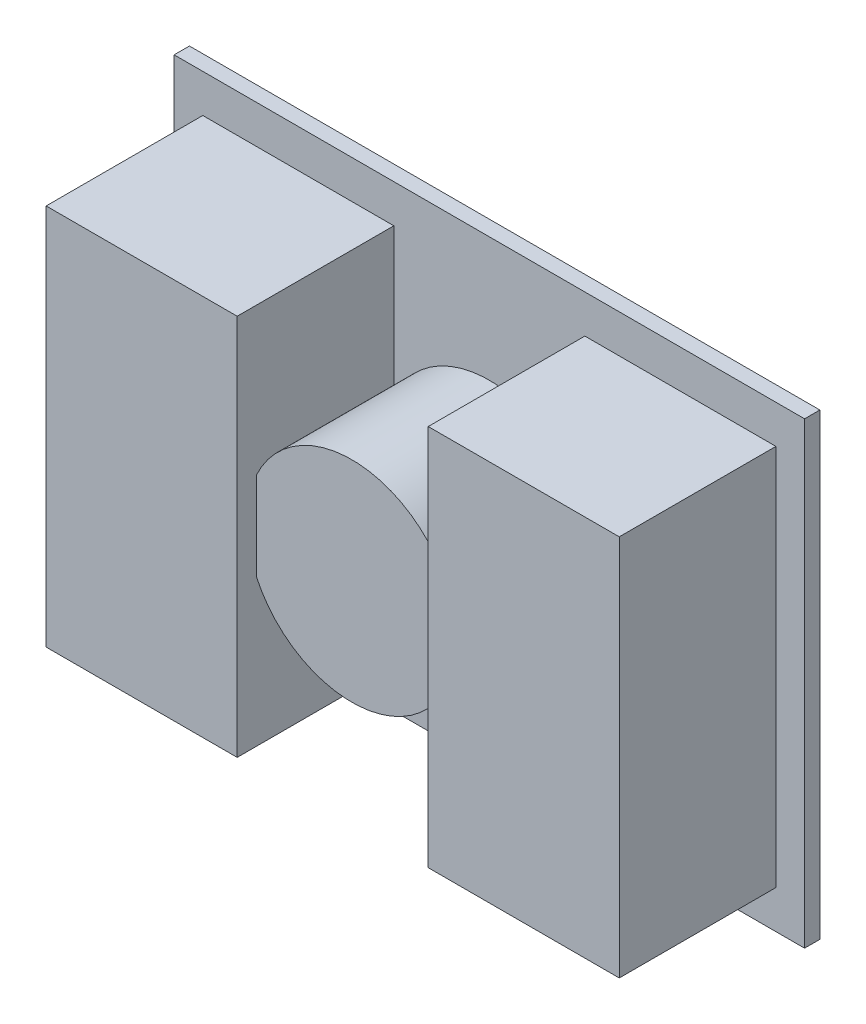
ISO-10303-21;
HEADER;
FILE_DESCRIPTION(('STEP AP214'),'2;1');
FILE_NAME('part.step','',(''),(''),'','','');
FILE_SCHEMA(('AUTOMOTIVE_DESIGN { 1 0 10303 214 1 1 1 1 }'));
ENDSEC;
DATA;
#1=APPLICATION_CONTEXT('core data for automotive mechanical design processes');
#2=APPLICATION_PROTOCOL_DEFINITION('international standard','automotive_design',2000,#1);
#3=PRODUCT_CONTEXT('',#1,'mechanical');
#4=PRODUCT('Part','Part','',(#3));
#5=PRODUCT_RELATED_PRODUCT_CATEGORY('part','',(#4));
#6=PRODUCT_DEFINITION_FORMATION('','',#4);
#7=PRODUCT_DEFINITION_CONTEXT('part definition',#1,'design');
#8=PRODUCT_DEFINITION('design','',#6,#7);
#9=PRODUCT_DEFINITION_SHAPE('','',#8);
#10=(LENGTH_UNIT() NAMED_UNIT(*) SI_UNIT(.MILLI.,.METRE.));
#11=(NAMED_UNIT(*) PLANE_ANGLE_UNIT() SI_UNIT($,.RADIAN.));
#12=(NAMED_UNIT(*) SI_UNIT($,.STERADIAN.) SOLID_ANGLE_UNIT());
#13=UNCERTAINTY_MEASURE_WITH_UNIT(LENGTH_MEASURE(1.E-05),#10,'distance_accuracy_value','');
#14=(GEOMETRIC_REPRESENTATION_CONTEXT(3) GLOBAL_UNCERTAINTY_ASSIGNED_CONTEXT((#13)) GLOBAL_UNIT_ASSIGNED_CONTEXT((#10,
#11,#12)) REPRESENTATION_CONTEXT('',''));
#15=CARTESIAN_POINT('',(0.,0.,0.));
#16=DIRECTION('',(0.,0.,1.));
#17=DIRECTION('',(1.,0.,0.));
#18=AXIS2_PLACEMENT_3D('',#15,#16,#17);
#19=CARTESIAN_POINT('',(0.,0.,1.6));
#20=DIRECTION('',(0.,0.,1.));
#21=DIRECTION('',(1.,0.,0.));
#22=AXIS2_PLACEMENT_3D('',#19,#20,#21);
#23=PLANE('',#22);
#24=DIRECTION('',(0.,-1.,0.));
#25=VECTOR('',#24,1.);
#26=CARTESIAN_POINT('',(-33.,24.,1.6));
#27=LINE('',#26,#25);
#28=CARTESIAN_POINT('',(-33.,24.,1.6));
#29=VERTEX_POINT('',#28);
#30=CARTESIAN_POINT('',(-33.,-24.,1.6));
#31=VERTEX_POINT('',#30);
#32=EDGE_CURVE('E234',#29,#31,#27,.T.);
#33=ORIENTED_EDGE('',*,*,#32,.T.);
#34=DIRECTION('',(1.,0.,0.));
#35=VECTOR('',#34,1.);
#36=CARTESIAN_POINT('',(-33.,-24.,1.6));
#37=LINE('',#36,#35);
#38=CARTESIAN_POINT('',(33.,-24.,1.6));
#39=VERTEX_POINT('',#38);
#40=EDGE_CURVE('E237',#31,#39,#37,.T.);
#41=ORIENTED_EDGE('',*,*,#40,.T.);
#42=DIRECTION('',(0.,1.,0.));
#43=VECTOR('',#42,1.);
#44=CARTESIAN_POINT('',(33.,-24.,1.6));
#45=LINE('',#44,#43);
#46=CARTESIAN_POINT('',(33.,24.,1.6));
#47=VERTEX_POINT('',#46);
#48=EDGE_CURVE('E239',#39,#47,#45,.T.);
#49=ORIENTED_EDGE('',*,*,#48,.T.);
#50=DIRECTION('',(-1.,0.,0.));
#51=VECTOR('',#50,1.);
#52=CARTESIAN_POINT('',(33.,24.,1.6));
#53=LINE('',#52,#51);
#54=EDGE_CURVE('E244',#47,#29,#53,.T.);
#55=ORIENTED_EDGE('',*,*,#54,.T.);
#56=EDGE_LOOP('',(#33,#41,#49,#55));
#57=FACE_BOUND('',#56,.T.);
#58=CARTESIAN_POINT('',(0.,0.,1.6));
#59=DIRECTION('',(0.,0.,1.));
#60=DIRECTION('',(1.,0.,0.));
#61=AXIS2_PLACEMENT_3D('',#58,#59,#60);
#62=CIRCLE('',#61,11.);
#63=CARTESIAN_POINT('',(10.,4.58257569495584,1.6));
#64=VERTEX_POINT('',#63);
#65=CARTESIAN_POINT('',(-10.,4.58257569495584,1.6));
#66=VERTEX_POINT('',#65);
#67=EDGE_CURVE('E152',#64,#66,#62,.T.);
#68=ORIENTED_EDGE('',*,*,#67,.F.);
#69=DIRECTION('',(0.,-1.,0.));
#70=VECTOR('',#69,1.);
#71=CARTESIAN_POINT('',(10.,20.,1.6));
#72=LINE('',#71,#70);
#73=CARTESIAN_POINT('',(10.,20.,1.6));
#74=VERTEX_POINT('',#73);
#75=EDGE_CURVE('E167',#74,#64,#72,.T.);
#76=ORIENTED_EDGE('',*,*,#75,.F.);
#77=DIRECTION('',(-1.,0.,0.));
#78=VECTOR('',#77,1.);
#79=CARTESIAN_POINT('',(30.,20.,1.6));
#80=LINE('',#79,#78);
#81=CARTESIAN_POINT('',(30.,20.,1.6));
#82=VERTEX_POINT('',#81);
#83=EDGE_CURVE('E190',#82,#74,#80,.T.);
#84=ORIENTED_EDGE('',*,*,#83,.F.);
#85=DIRECTION('',(0.,1.,0.));
#86=VECTOR('',#85,1.);
#87=CARTESIAN_POINT('',(30.,-20.,1.6));
#88=LINE('',#87,#86);
#89=CARTESIAN_POINT('',(30.,-20.,1.6));
#90=VERTEX_POINT('',#89);
#91=EDGE_CURVE('E180',#90,#82,#88,.T.);
#92=ORIENTED_EDGE('',*,*,#91,.F.);
#93=DIRECTION('',(1.,0.,0.));
#94=VECTOR('',#93,1.);
#95=CARTESIAN_POINT('',(10.,-20.,1.6));
#96=LINE('',#95,#94);
#97=CARTESIAN_POINT('',(10.,-20.,1.6));
#98=VERTEX_POINT('',#97);
#99=EDGE_CURVE('E177',#98,#90,#96,.T.);
#100=ORIENTED_EDGE('',*,*,#99,.F.);
#101=CARTESIAN_POINT('',(10.,-4.58257569495584,1.6));
#102=VERTEX_POINT('',#101);
#103=EDGE_CURVE('E179',#102,#98,#72,.T.);
#104=ORIENTED_EDGE('',*,*,#103,.F.);
#105=CARTESIAN_POINT('',(-10.,-4.58257569495584,1.6));
#106=VERTEX_POINT('',#105);
#107=EDGE_CURVE('E166',#106,#102,#62,.T.);
#108=ORIENTED_EDGE('',*,*,#107,.F.);
#109=DIRECTION('',(0.,1.,0.));
#110=VECTOR('',#109,1.);
#111=CARTESIAN_POINT('',(-10.,-20.,1.6));
#112=LINE('',#111,#110);
#113=CARTESIAN_POINT('',(-10.,-20.,1.6));
#114=VERTEX_POINT('',#113);
#115=EDGE_CURVE('E216',#114,#106,#112,.T.);
#116=ORIENTED_EDGE('',*,*,#115,.F.);
#117=DIRECTION('',(1.,0.,0.));
#118=VECTOR('',#117,1.);
#119=CARTESIAN_POINT('',(-30.,-20.,1.6));
#120=LINE('',#119,#118);
#121=CARTESIAN_POINT('',(-30.,-20.,1.6));
#122=VERTEX_POINT('',#121);
#123=EDGE_CURVE('E213',#122,#114,#120,.T.);
#124=ORIENTED_EDGE('',*,*,#123,.F.);
#125=DIRECTION('',(0.,-1.,0.));
#126=VECTOR('',#125,1.);
#127=CARTESIAN_POINT('',(-30.,20.,1.6));
#128=LINE('',#127,#126);
#129=CARTESIAN_POINT('',(-30.,20.,1.6));
#130=VERTEX_POINT('',#129);
#131=EDGE_CURVE('E200',#130,#122,#128,.T.);
#132=ORIENTED_EDGE('',*,*,#131,.F.);
#133=DIRECTION('',(-1.,0.,0.));
#134=VECTOR('',#133,1.);
#135=CARTESIAN_POINT('',(-10.,20.,1.6));
#136=LINE('',#135,#134);
#137=CARTESIAN_POINT('',(-10.,20.,1.6));
#138=VERTEX_POINT('',#137);
#139=EDGE_CURVE('E204',#138,#130,#136,.T.);
#140=ORIENTED_EDGE('',*,*,#139,.F.);
#141=EDGE_CURVE('E169',#66,#138,#112,.T.);
#142=ORIENTED_EDGE('',*,*,#141,.F.);
#143=EDGE_LOOP('',(#68,#76,#84,#92,#100,#104,#108,#116,#124,#132,#140,#142));
#144=FACE_BOUND('',#143,.T.);
#145=ADVANCED_FACE('F39',(#57,#144),#23,.T.);
#146=CARTESIAN_POINT('',(-10.,-20.,18.));
#147=DIRECTION('',(-1.,0.,0.));
#148=DIRECTION('',(0.,0.,1.));
#149=AXIS2_PLACEMENT_3D('',#146,#147,#148);
#150=PLANE('',#149);
#151=DIRECTION('',(0.,0.,-1.));
#152=VECTOR('',#151,1.);
#153=CARTESIAN_POINT('',(-10.,4.58257569495584,16.));
#154=LINE('',#153,#152);
#155=CARTESIAN_POINT('',(-10.,4.58257569495584,16.));
#156=VERTEX_POINT('',#155);
#157=EDGE_CURVE('E185',#66,#156,#154,.F.);
#158=ORIENTED_EDGE('',*,*,#157,.F.);
#159=ORIENTED_EDGE('',*,*,#141,.T.);
#160=DIRECTION('',(0.,0.,-1.));
#161=VECTOR('',#160,1.);
#162=CARTESIAN_POINT('',(-10.,20.,18.));
#163=LINE('',#162,#161);
#164=CARTESIAN_POINT('',(-10.,20.,18.));
#165=VERTEX_POINT('',#164);
#166=EDGE_CURVE('E224',#165,#138,#163,.T.);
#167=ORIENTED_EDGE('',*,*,#166,.F.);
#168=DIRECTION('',(0.,1.,0.));
#169=VECTOR('',#168,1.);
#170=CARTESIAN_POINT('',(-10.,-20.,18.));
#171=LINE('',#170,#169);
#172=CARTESIAN_POINT('',(-10.,-20.,18.));
#173=VERTEX_POINT('',#172);
#174=EDGE_CURVE('E206',#173,#165,#171,.T.);
#175=ORIENTED_EDGE('',*,*,#174,.F.);
#176=DIRECTION('',(0.,0.,-1.));
#177=VECTOR('',#176,1.);
#178=CARTESIAN_POINT('',(-10.,-20.,18.));
#179=LINE('',#178,#177);
#180=EDGE_CURVE('E229',#173,#114,#179,.T.);
#181=ORIENTED_EDGE('',*,*,#180,.T.);
#182=ORIENTED_EDGE('',*,*,#115,.T.);
#183=DIRECTION('',(0.,0.,-1.));
#184=VECTOR('',#183,1.);
#185=CARTESIAN_POINT('',(-10.,-4.58257569495584,16.));
#186=LINE('',#185,#184);
#187=CARTESIAN_POINT('',(-10.,-4.58257569495584,16.));
#188=VERTEX_POINT('',#187);
#189=EDGE_CURVE('E269',#188,#106,#186,.T.);
#190=ORIENTED_EDGE('',*,*,#189,.F.);
#191=DIRECTION('',(0.,1.,0.));
#192=VECTOR('',#191,1.);
#193=CARTESIAN_POINT('',(-10.,-20.,16.));
#194=LINE('',#193,#192);
#195=EDGE_CURVE('E264',#188,#156,#194,.T.);
#196=ORIENTED_EDGE('',*,*,#195,.T.);
#197=EDGE_LOOP('',(#158,#159,#167,#175,#181,#182,#190,#196));
#198=FACE_BOUND('',#197,.T.);
#199=ADVANCED_FACE('F267',(#198),#150,.F.);
#200=CARTESIAN_POINT('',(10.,20.,18.));
#201=DIRECTION('',(1.,0.,0.));
#202=DIRECTION('',(0.,0.,-1.));
#203=AXIS2_PLACEMENT_3D('',#200,#201,#202);
#204=PLANE('',#203);
#205=DIRECTION('',(0.,0.,-1.));
#206=VECTOR('',#205,1.);
#207=CARTESIAN_POINT('',(10.,-4.58257569495584,16.));
#208=LINE('',#207,#206);
#209=CARTESIAN_POINT('',(10.,-4.58257569495584,16.));
#210=VERTEX_POINT('',#209);
#211=EDGE_CURVE('E11',#102,#210,#208,.F.);
#212=ORIENTED_EDGE('',*,*,#211,.F.);
#213=ORIENTED_EDGE('',*,*,#103,.T.);
#214=DIRECTION('',(0.,0.,-1.));
#215=VECTOR('',#214,1.);
#216=CARTESIAN_POINT('',(10.,-20.,18.));
#217=LINE('',#216,#215);
#218=CARTESIAN_POINT('',(10.,-20.,18.));
#219=VERTEX_POINT('',#218);
#220=EDGE_CURVE('E198',#219,#98,#217,.T.);
#221=ORIENTED_EDGE('',*,*,#220,.F.);
#222=DIRECTION('',(0.,-1.,0.));
#223=VECTOR('',#222,1.);
#224=CARTESIAN_POINT('',(10.,20.,18.));
#225=LINE('',#224,#223);
#226=CARTESIAN_POINT('',(10.,20.,18.));
#227=VERTEX_POINT('',#226);
#228=EDGE_CURVE('E187',#227,#219,#225,.T.);
#229=ORIENTED_EDGE('',*,*,#228,.F.);
#230=DIRECTION('',(0.,0.,-1.));
#231=VECTOR('',#230,1.);
#232=CARTESIAN_POINT('',(10.,20.,18.));
#233=LINE('',#232,#231);
#234=EDGE_CURVE('E176',#227,#74,#233,.T.);
#235=ORIENTED_EDGE('',*,*,#234,.T.);
#236=ORIENTED_EDGE('',*,*,#75,.T.);
#237=DIRECTION('',(0.,0.,-1.));
#238=VECTOR('',#237,1.);
#239=CARTESIAN_POINT('',(10.,4.58257569495584,16.));
#240=LINE('',#239,#238);
#241=CARTESIAN_POINT('',(10.,4.58257569495584,16.));
#242=VERTEX_POINT('',#241);
#243=EDGE_CURVE('E50',#242,#64,#240,.T.);
#244=ORIENTED_EDGE('',*,*,#243,.F.);
#245=DIRECTION('',(0.,-1.,0.));
#246=VECTOR('',#245,1.);
#247=CARTESIAN_POINT('',(10.,20.,16.));
#248=LINE('',#247,#246);
#249=EDGE_CURVE('E161',#242,#210,#248,.T.);
#250=ORIENTED_EDGE('',*,*,#249,.T.);
#251=EDGE_LOOP('',(#212,#213,#221,#229,#235,#236,#244,#250));
#252=FACE_BOUND('',#251,.T.);
#253=ADVANCED_FACE('F175',(#252),#204,.F.);
#254=CARTESIAN_POINT('',(-33.,24.,1.6));
#255=DIRECTION('',(1.,0.,0.));
#256=DIRECTION('',(0.,0.,-1.));
#257=AXIS2_PLACEMENT_3D('',#254,#255,#256);
#258=PLANE('',#257);
#259=DIRECTION('',(0.,-1.,0.));
#260=VECTOR('',#259,1.);
#261=CARTESIAN_POINT('',(-33.,24.,0.));
#262=LINE('',#261,#260);
#263=CARTESIAN_POINT('',(-33.,24.,0.));
#264=VERTEX_POINT('',#263);
#265=CARTESIAN_POINT('',(-33.,-24.,0.));
#266=VERTEX_POINT('',#265);
#267=EDGE_CURVE('E232',#264,#266,#262,.T.);
#268=ORIENTED_EDGE('',*,*,#267,.T.);
#269=DIRECTION('',(0.,0.,-1.));
#270=VECTOR('',#269,1.);
#271=CARTESIAN_POINT('',(-33.,-24.,1.6));
#272=LINE('',#271,#270);
#273=EDGE_CURVE('E259',#31,#266,#272,.T.);
#274=ORIENTED_EDGE('',*,*,#273,.F.);
#275=ORIENTED_EDGE('',*,*,#32,.F.);
#276=DIRECTION('',(0.,0.,-1.));
#277=VECTOR('',#276,1.);
#278=CARTESIAN_POINT('',(-33.,24.,1.6));
#279=LINE('',#278,#277);
#280=EDGE_CURVE('E245',#29,#264,#279,.T.);
#281=ORIENTED_EDGE('',*,*,#280,.T.);
#282=EDGE_LOOP('',(#268,#274,#275,#281));
#283=FACE_BOUND('',#282,.T.);
#284=ADVANCED_FACE('F41',(#283),#258,.F.);
#285=CARTESIAN_POINT('',(-33.,-24.,1.6));
#286=DIRECTION('',(0.,1.,0.));
#287=DIRECTION('',(0.,0.,1.));
#288=AXIS2_PLACEMENT_3D('',#285,#286,#287);
#289=PLANE('',#288);
#290=DIRECTION('',(1.,0.,0.));
#291=VECTOR('',#290,1.);
#292=CARTESIAN_POINT('',(-33.,-24.,0.));
#293=LINE('',#292,#291);
#294=CARTESIAN_POINT('',(33.,-24.,0.));
#295=VERTEX_POINT('',#294);
#296=EDGE_CURVE('E246',#266,#295,#293,.T.);
#297=ORIENTED_EDGE('',*,*,#296,.T.);
#298=DIRECTION('',(0.,0.,-1.));
#299=VECTOR('',#298,1.);
#300=CARTESIAN_POINT('',(33.,-24.,1.6));
#301=LINE('',#300,#299);
#302=EDGE_CURVE('E258',#39,#295,#301,.T.);
#303=ORIENTED_EDGE('',*,*,#302,.F.);
#304=ORIENTED_EDGE('',*,*,#40,.F.);
#305=ORIENTED_EDGE('',*,*,#273,.T.);
#306=EDGE_LOOP('',(#297,#303,#304,#305));
#307=FACE_BOUND('',#306,.T.);
#308=ADVANCED_FACE('F323',(#307),#289,.F.);
#309=CARTESIAN_POINT('',(33.,-24.,1.6));
#310=DIRECTION('',(-1.,0.,0.));
#311=DIRECTION('',(0.,0.,1.));
#312=AXIS2_PLACEMENT_3D('',#309,#310,#311);
#313=PLANE('',#312);
#314=DIRECTION('',(0.,1.,0.));
#315=VECTOR('',#314,1.);
#316=CARTESIAN_POINT('',(33.,-24.,0.));
#317=LINE('',#316,#315);
#318=CARTESIAN_POINT('',(33.,24.,0.));
#319=VERTEX_POINT('',#318);
#320=EDGE_CURVE('E249',#295,#319,#317,.T.);
#321=ORIENTED_EDGE('',*,*,#320,.T.);
#322=DIRECTION('',(0.,0.,-1.));
#323=VECTOR('',#322,1.);
#324=CARTESIAN_POINT('',(33.,24.,1.6));
#325=LINE('',#324,#323);
#326=EDGE_CURVE('E251',#47,#319,#325,.T.);
#327=ORIENTED_EDGE('',*,*,#326,.F.);
#328=ORIENTED_EDGE('',*,*,#48,.F.);
#329=ORIENTED_EDGE('',*,*,#302,.T.);
#330=EDGE_LOOP('',(#321,#327,#328,#329));
#331=FACE_BOUND('',#330,.T.);
#332=ADVANCED_FACE('F319',(#331),#313,.F.);
#333=CARTESIAN_POINT('',(33.,24.,1.6));
#334=DIRECTION('',(0.,-1.,0.));
#335=DIRECTION('',(0.,0.,-1.));
#336=AXIS2_PLACEMENT_3D('',#333,#334,#335);
#337=PLANE('',#336);
#338=DIRECTION('',(-1.,0.,0.));
#339=VECTOR('',#338,1.);
#340=CARTESIAN_POINT('',(33.,24.,0.));
#341=LINE('',#340,#339);
#342=EDGE_CURVE('E240',#319,#264,#341,.T.);
#343=ORIENTED_EDGE('',*,*,#342,.T.);
#344=ORIENTED_EDGE('',*,*,#280,.F.);
#345=ORIENTED_EDGE('',*,*,#54,.F.);
#346=ORIENTED_EDGE('',*,*,#326,.T.);
#347=EDGE_LOOP('',(#343,#344,#345,#346));
#348=FACE_BOUND('',#347,.T.);
#349=ADVANCED_FACE('F316',(#348),#337,.F.);
#350=CARTESIAN_POINT('',(0.,0.,0.));
#351=DIRECTION('',(0.,0.,1.));
#352=DIRECTION('',(1.,0.,0.));
#353=AXIS2_PLACEMENT_3D('',#350,#351,#352);
#354=PLANE('',#353);
#355=ORIENTED_EDGE('',*,*,#267,.F.);
#356=ORIENTED_EDGE('',*,*,#342,.F.);
#357=ORIENTED_EDGE('',*,*,#320,.F.);
#358=ORIENTED_EDGE('',*,*,#296,.F.);
#359=EDGE_LOOP('',(#355,#356,#357,#358));
#360=FACE_BOUND('',#359,.T.);
#361=ADVANCED_FACE('F311',(#360),#354,.F.);
#362=CARTESIAN_POINT('',(-30.,20.,18.));
#363=DIRECTION('',(1.,0.,0.));
#364=DIRECTION('',(0.,0.,-1.));
#365=AXIS2_PLACEMENT_3D('',#362,#363,#364);
#366=PLANE('',#365);
#367=ORIENTED_EDGE('',*,*,#131,.T.);
#368=DIRECTION('',(0.,0.,-1.));
#369=VECTOR('',#368,1.);
#370=CARTESIAN_POINT('',(-30.,-20.,18.));
#371=LINE('',#370,#369);
#372=CARTESIAN_POINT('',(-30.,-20.,18.));
#373=VERTEX_POINT('',#372);
#374=EDGE_CURVE('E228',#373,#122,#371,.T.);
#375=ORIENTED_EDGE('',*,*,#374,.F.);
#376=DIRECTION('',(0.,-1.,0.));
#377=VECTOR('',#376,1.);
#378=CARTESIAN_POINT('',(-30.,20.,18.));
#379=LINE('',#378,#377);
#380=CARTESIAN_POINT('',(-30.,20.,18.));
#381=VERTEX_POINT('',#380);
#382=EDGE_CURVE('E199',#381,#373,#379,.T.);
#383=ORIENTED_EDGE('',*,*,#382,.F.);
#384=DIRECTION('',(0.,0.,-1.));
#385=VECTOR('',#384,1.);
#386=CARTESIAN_POINT('',(-30.,20.,18.));
#387=LINE('',#386,#385);
#388=EDGE_CURVE('E209',#381,#130,#387,.T.);
#389=ORIENTED_EDGE('',*,*,#388,.T.);
#390=EDGE_LOOP('',(#367,#375,#383,#389));
#391=FACE_BOUND('',#390,.T.);
#392=ADVANCED_FACE('F313',(#391),#366,.F.);
#393=CARTESIAN_POINT('',(-30.,-20.,18.));
#394=DIRECTION('',(0.,1.,0.));
#395=DIRECTION('',(0.,0.,1.));
#396=AXIS2_PLACEMENT_3D('',#393,#394,#395);
#397=PLANE('',#396);
#398=ORIENTED_EDGE('',*,*,#123,.T.);
#399=ORIENTED_EDGE('',*,*,#180,.F.);
#400=DIRECTION('',(1.,0.,0.));
#401=VECTOR('',#400,1.);
#402=CARTESIAN_POINT('',(-30.,-20.,18.));
#403=LINE('',#402,#401);
#404=EDGE_CURVE('E201',#373,#173,#403,.T.);
#405=ORIENTED_EDGE('',*,*,#404,.F.);
#406=ORIENTED_EDGE('',*,*,#374,.T.);
#407=EDGE_LOOP('',(#398,#399,#405,#406));
#408=FACE_BOUND('',#407,.T.);
#409=ADVANCED_FACE('F353',(#408),#397,.F.);
#410=CARTESIAN_POINT('',(-10.,20.,18.));
#411=DIRECTION('',(0.,-1.,0.));
#412=DIRECTION('',(0.,0.,-1.));
#413=AXIS2_PLACEMENT_3D('',#410,#411,#412);
#414=PLANE('',#413);
#415=ORIENTED_EDGE('',*,*,#139,.T.);
#416=ORIENTED_EDGE('',*,*,#388,.F.);
#417=DIRECTION('',(-1.,0.,0.));
#418=VECTOR('',#417,1.);
#419=CARTESIAN_POINT('',(-10.,20.,18.));
#420=LINE('',#419,#418);
#421=EDGE_CURVE('E208',#165,#381,#420,.T.);
#422=ORIENTED_EDGE('',*,*,#421,.F.);
#423=ORIENTED_EDGE('',*,*,#166,.T.);
#424=EDGE_LOOP('',(#415,#416,#422,#423));
#425=FACE_BOUND('',#424,.T.);
#426=ADVANCED_FACE('F354',(#425),#414,.F.);
#427=CARTESIAN_POINT('',(0.,0.,18.));
#428=DIRECTION('',(0.,0.,1.));
#429=DIRECTION('',(1.,0.,0.));
#430=AXIS2_PLACEMENT_3D('',#427,#428,#429);
#431=PLANE('',#430);
#432=ORIENTED_EDGE('',*,*,#382,.T.);
#433=ORIENTED_EDGE('',*,*,#404,.T.);
#434=ORIENTED_EDGE('',*,*,#174,.T.);
#435=ORIENTED_EDGE('',*,*,#421,.T.);
#436=EDGE_LOOP('',(#432,#433,#434,#435));
#437=FACE_BOUND('',#436,.T.);
#438=ADVANCED_FACE('F298',(#437),#431,.T.);
#439=CARTESIAN_POINT('',(10.,-20.,18.));
#440=DIRECTION('',(0.,1.,0.));
#441=DIRECTION('',(0.,0.,1.));
#442=AXIS2_PLACEMENT_3D('',#439,#440,#441);
#443=PLANE('',#442);
#444=ORIENTED_EDGE('',*,*,#99,.T.);
#445=DIRECTION('',(0.,0.,-1.));
#446=VECTOR('',#445,1.);
#447=CARTESIAN_POINT('',(30.,-20.,18.));
#448=LINE('',#447,#446);
#449=CARTESIAN_POINT('',(30.,-20.,18.));
#450=VERTEX_POINT('',#449);
#451=EDGE_CURVE('E194',#450,#90,#448,.T.);
#452=ORIENTED_EDGE('',*,*,#451,.F.);
#453=DIRECTION('',(1.,0.,0.));
#454=VECTOR('',#453,1.);
#455=CARTESIAN_POINT('',(10.,-20.,18.));
#456=LINE('',#455,#454);
#457=EDGE_CURVE('E280',#219,#450,#456,.T.);
#458=ORIENTED_EDGE('',*,*,#457,.F.);
#459=ORIENTED_EDGE('',*,*,#220,.T.);
#460=EDGE_LOOP('',(#444,#452,#458,#459));
#461=FACE_BOUND('',#460,.T.);
#462=ADVANCED_FACE('F286',(#461),#443,.F.);
#463=CARTESIAN_POINT('',(30.,-20.,18.));
#464=DIRECTION('',(-1.,0.,0.));
#465=DIRECTION('',(0.,0.,1.));
#466=AXIS2_PLACEMENT_3D('',#463,#464,#465);
#467=PLANE('',#466);
#468=ORIENTED_EDGE('',*,*,#91,.T.);
#469=DIRECTION('',(0.,0.,-1.));
#470=VECTOR('',#469,1.);
#471=CARTESIAN_POINT('',(30.,20.,18.));
#472=LINE('',#471,#470);
#473=CARTESIAN_POINT('',(30.,20.,18.));
#474=VERTEX_POINT('',#473);
#475=EDGE_CURVE('E64',#474,#82,#472,.T.);
#476=ORIENTED_EDGE('',*,*,#475,.F.);
#477=DIRECTION('',(0.,1.,0.));
#478=VECTOR('',#477,1.);
#479=CARTESIAN_POINT('',(30.,-20.,18.));
#480=LINE('',#479,#478);
#481=EDGE_CURVE('E279',#450,#474,#480,.T.);
#482=ORIENTED_EDGE('',*,*,#481,.F.);
#483=ORIENTED_EDGE('',*,*,#451,.T.);
#484=EDGE_LOOP('',(#468,#476,#482,#483));
#485=FACE_BOUND('',#484,.T.);
#486=ADVANCED_FACE('F292',(#485),#467,.F.);
#487=CARTESIAN_POINT('',(30.,20.,18.));
#488=DIRECTION('',(0.,-1.,0.));
#489=DIRECTION('',(0.,0.,-1.));
#490=AXIS2_PLACEMENT_3D('',#487,#488,#489);
#491=PLANE('',#490);
#492=ORIENTED_EDGE('',*,*,#83,.T.);
#493=ORIENTED_EDGE('',*,*,#234,.F.);
#494=DIRECTION('',(-1.,0.,0.));
#495=VECTOR('',#494,1.);
#496=CARTESIAN_POINT('',(30.,20.,18.));
#497=LINE('',#496,#495);
#498=EDGE_CURVE('E184',#474,#227,#497,.T.);
#499=ORIENTED_EDGE('',*,*,#498,.F.);
#500=ORIENTED_EDGE('',*,*,#475,.T.);
#501=EDGE_LOOP('',(#492,#493,#499,#500));
#502=FACE_BOUND('',#501,.T.);
#503=ADVANCED_FACE('F285',(#502),#491,.F.);
#504=CARTESIAN_POINT('',(0.,0.,18.));
#505=DIRECTION('',(0.,0.,1.));
#506=DIRECTION('',(1.,0.,0.));
#507=AXIS2_PLACEMENT_3D('',#504,#505,#506);
#508=PLANE('',#507);
#509=ORIENTED_EDGE('',*,*,#228,.T.);
#510=ORIENTED_EDGE('',*,*,#457,.T.);
#511=ORIENTED_EDGE('',*,*,#481,.T.);
#512=ORIENTED_EDGE('',*,*,#498,.T.);
#513=EDGE_LOOP('',(#509,#510,#511,#512));
#514=FACE_BOUND('',#513,.T.);
#515=ADVANCED_FACE('F284',(#514),#508,.T.);
#516=CARTESIAN_POINT('',(0.,0.,16.));
#517=DIRECTION('',(0.,0.,-1.));
#518=DIRECTION('',(-1.,0.,0.));
#519=AXIS2_PLACEMENT_3D('',#516,#517,#518);
#520=CYLINDRICAL_SURFACE('',#519,11.);
#521=ORIENTED_EDGE('',*,*,#67,.T.);
#522=ORIENTED_EDGE('',*,*,#157,.T.);
#523=CARTESIAN_POINT('',(0.,0.,16.));
#524=DIRECTION('',(0.,0.,1.));
#525=DIRECTION('',(1.,0.,0.));
#526=AXIS2_PLACEMENT_3D('',#523,#524,#525);
#527=CIRCLE('',#526,11.);
#528=EDGE_CURVE('E160',#242,#156,#527,.T.);
#529=ORIENTED_EDGE('',*,*,#528,.F.);
#530=ORIENTED_EDGE('',*,*,#243,.T.);
#531=EDGE_LOOP('',(#521,#522,#529,#530));
#532=FACE_BOUND('',#531,.T.);
#533=ADVANCED_FACE('F153',(#532),#520,.T.);
#534=EDGE_CURVE('E53',#188,#210,#527,.T.);
#535=ORIENTED_EDGE('',*,*,#534,.F.);
#536=ORIENTED_EDGE('',*,*,#189,.T.);
#537=ORIENTED_EDGE('',*,*,#107,.T.);
#538=ORIENTED_EDGE('',*,*,#211,.T.);
#539=EDGE_LOOP('',(#535,#536,#537,#538));
#540=FACE_BOUND('',#539,.T.);
#541=ADVANCED_FACE('F367',(#540),#520,.T.);
#542=CARTESIAN_POINT('',(0.,0.,16.));
#543=DIRECTION('',(0.,0.,1.));
#544=DIRECTION('',(1.,0.,0.));
#545=AXIS2_PLACEMENT_3D('',#542,#543,#544);
#546=PLANE('',#545);
#547=ORIENTED_EDGE('',*,*,#195,.F.);
#548=ORIENTED_EDGE('',*,*,#534,.T.);
#549=ORIENTED_EDGE('',*,*,#249,.F.);
#550=ORIENTED_EDGE('',*,*,#528,.T.);
#551=EDGE_LOOP('',(#547,#548,#549,#550));
#552=FACE_BOUND('',#551,.T.);
#553=ADVANCED_FACE('F263',(#552),#546,.T.);
#554=CLOSED_SHELL('',(#145,#199,#253,#284,#308,#332,#349,#361,#392,#409,#426,#438,#462,#486,
#503,#515,#533,#541,#553));
#555=MANIFOLD_SOLID_BREP('B2',#554);
#556=ADVANCED_BREP_SHAPE_REPRESENTATION('',(#18,#555),#14);
#557=SHAPE_DEFINITION_REPRESENTATION(#9,#556);
ENDSEC;
END-ISO-10303-21;
